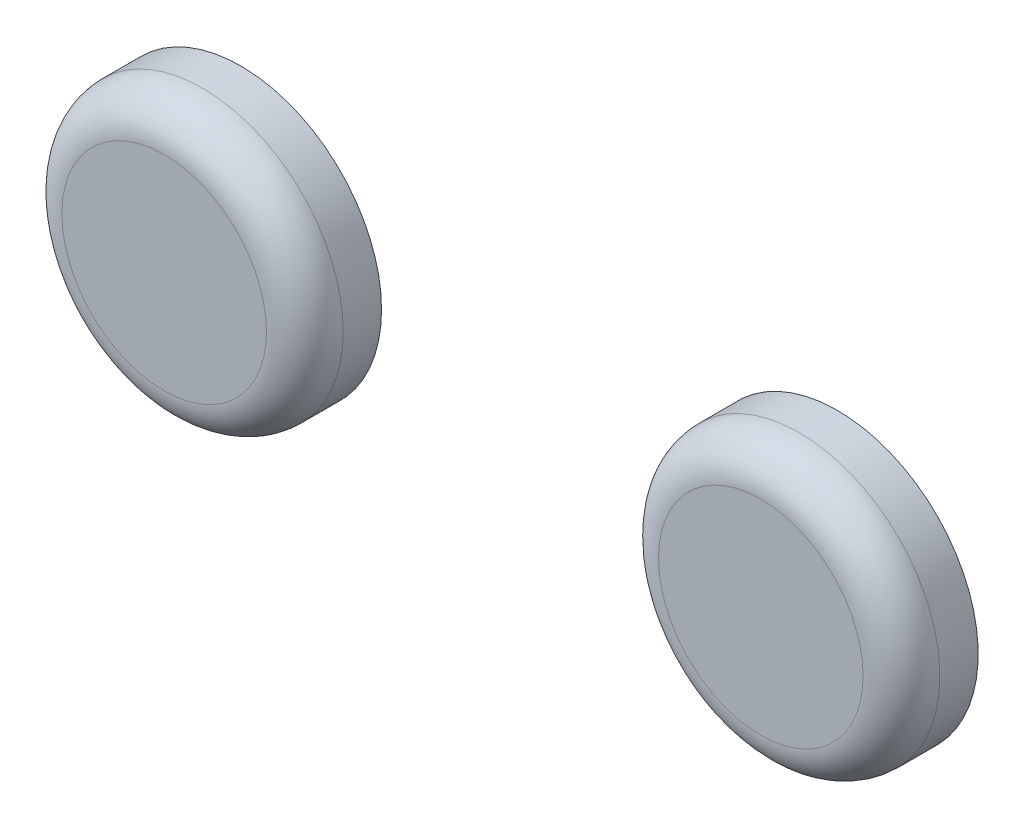
ISO-10303-21;
HEADER;
FILE_DESCRIPTION(('STEP AP214'),'2;1');
FILE_NAME('part.step','',(''),(''),'','','');
FILE_SCHEMA(('AUTOMOTIVE_DESIGN { 1 0 10303 214 1 1 1 1 }'));
ENDSEC;
DATA;
#1=APPLICATION_CONTEXT('core data for automotive mechanical design processes');
#2=APPLICATION_PROTOCOL_DEFINITION('international standard','automotive_design',2000,#1);
#3=PRODUCT_CONTEXT('',#1,'mechanical');
#4=PRODUCT('Part','Part','',(#3));
#5=PRODUCT_RELATED_PRODUCT_CATEGORY('part','',(#4));
#6=PRODUCT_DEFINITION_FORMATION('','',#4);
#7=PRODUCT_DEFINITION_CONTEXT('part definition',#1,'design');
#8=PRODUCT_DEFINITION('design','',#6,#7);
#9=PRODUCT_DEFINITION_SHAPE('','',#8);
#10=(LENGTH_UNIT() NAMED_UNIT(*) SI_UNIT(.MILLI.,.METRE.));
#11=(NAMED_UNIT(*) PLANE_ANGLE_UNIT() SI_UNIT($,.RADIAN.));
#12=(NAMED_UNIT(*) SI_UNIT($,.STERADIAN.) SOLID_ANGLE_UNIT());
#13=UNCERTAINTY_MEASURE_WITH_UNIT(LENGTH_MEASURE(1.E-05),#10,'distance_accuracy_value','');
#14=(GEOMETRIC_REPRESENTATION_CONTEXT(3) GLOBAL_UNCERTAINTY_ASSIGNED_CONTEXT((#13)) GLOBAL_UNIT_ASSIGNED_CONTEXT((#10,
#11,#12)) REPRESENTATION_CONTEXT('',''));
#15=CARTESIAN_POINT('',(0.,0.,0.));
#16=DIRECTION('',(0.,0.,1.));
#17=DIRECTION('',(1.,0.,0.));
#18=AXIS2_PLACEMENT_3D('',#15,#16,#17);
#19=CARTESIAN_POINT('',(70.,0.,18.));
#20=DIRECTION('',(0.,0.,-1.));
#21=DIRECTION('',(-1.,0.,0.));
#22=AXIS2_PLACEMENT_3D('',#19,#20,#21);
#23=CYLINDRICAL_SURFACE('',#22,33.);
#24=CARTESIAN_POINT('',(70.,0.,9.));
#25=DIRECTION('',(0.,0.,-1.));
#26=DIRECTION('',(-1.,0.,0.));
#27=AXIS2_PLACEMENT_3D('',#24,#25,#26);
#28=CIRCLE('',#27,33.);
#29=CARTESIAN_POINT('',(37.,0.,9.));
#30=VERTEX_POINT('',#29);
#31=EDGE_CURVE('E11',#30,#30,#28,.T.);
#32=ORIENTED_EDGE('',*,*,#31,.T.);
#33=EDGE_LOOP('',(#32));
#34=FACE_BOUND('',#33,.T.);
#35=CARTESIAN_POINT('',(70.,0.,0.));
#36=DIRECTION('',(0.,0.,1.));
#37=DIRECTION('',(-1.,0.,0.));
#38=AXIS2_PLACEMENT_3D('',#35,#36,#37);
#39=CIRCLE('',#38,33.);
#40=CARTESIAN_POINT('',(37.,0.,0.));
#41=VERTEX_POINT('',#40);
#42=EDGE_CURVE('E54',#41,#41,#39,.T.);
#43=ORIENTED_EDGE('',*,*,#42,.T.);
#44=EDGE_LOOP('',(#43));
#45=FACE_BOUND('',#44,.T.);
#46=ADVANCED_FACE('F43',(#34,#45),#23,.T.);
#47=CARTESIAN_POINT('',(70.,0.,18.));
#48=DIRECTION('',(0.,0.,-1.));
#49=DIRECTION('',(-1.,0.,0.));
#50=AXIS2_PLACEMENT_3D('',#47,#48,#49);
#51=PLANE('',#50);
#52=CARTESIAN_POINT('',(70.,0.,18.));
#53=DIRECTION('',(0.,0.,-1.));
#54=DIRECTION('',(-1.,0.,0.));
#55=AXIS2_PLACEMENT_3D('',#52,#53,#54);
#56=CIRCLE('',#55,24.);
#57=CARTESIAN_POINT('',(46.,0.,18.));
#58=VERTEX_POINT('',#57);
#59=EDGE_CURVE('E50',#58,#58,#56,.F.);
#60=ORIENTED_EDGE('',*,*,#59,.T.);
#61=EDGE_LOOP('',(#60));
#62=FACE_BOUND('',#61,.T.);
#63=ADVANCED_FACE('F64',(#62),#51,.F.);
#64=CARTESIAN_POINT('',(70.,0.,0.));
#65=DIRECTION('',(0.,0.,-1.));
#66=DIRECTION('',(-1.,0.,0.));
#67=AXIS2_PLACEMENT_3D('',#64,#65,#66);
#68=PLANE('',#67);
#69=ORIENTED_EDGE('',*,*,#42,.F.);
#70=EDGE_LOOP('',(#69));
#71=FACE_BOUND('',#70,.T.);
#72=ADVANCED_FACE('F62',(#71),#68,.T.);
#73=CARTESIAN_POINT('',(70.,0.,9.));
#74=DIRECTION('',(0.,0.,-1.));
#75=DIRECTION('',(-1.,0.,0.));
#76=AXIS2_PLACEMENT_3D('',#73,#74,#75);
#77=TOROIDAL_SURFACE('',#76,24.,9.);
#78=ORIENTED_EDGE('',*,*,#31,.F.);
#79=EDGE_LOOP('',(#78));
#80=FACE_BOUND('',#79,.T.);
#81=ORIENTED_EDGE('',*,*,#59,.F.);
#82=EDGE_LOOP('',(#81));
#83=FACE_BOUND('',#82,.T.);
#84=ADVANCED_FACE('F45',(#80,#83),#77,.T.);
#85=CLOSED_SHELL('',(#46,#63,#72,#84));
#86=MANIFOLD_SOLID_BREP('B2',#85);
#87=CARTESIAN_POINT('',(-70.,0.,18.));
#88=DIRECTION('',(0.,0.,-1.));
#89=DIRECTION('',(-1.,0.,0.));
#90=AXIS2_PLACEMENT_3D('',#87,#88,#89);
#91=CYLINDRICAL_SURFACE('',#90,33.);
#92=CARTESIAN_POINT('',(-70.,0.,9.));
#93=DIRECTION('',(0.,0.,1.));
#94=DIRECTION('',(1.,0.,0.));
#95=AXIS2_PLACEMENT_3D('',#92,#93,#94);
#96=CIRCLE('',#95,33.);
#97=CARTESIAN_POINT('',(-37.,0.,9.));
#98=VERTEX_POINT('',#97);
#99=EDGE_CURVE('E42',#98,#98,#96,.F.);
#100=ORIENTED_EDGE('',*,*,#99,.T.);
#101=EDGE_LOOP('',(#100));
#102=FACE_BOUND('',#101,.T.);
#103=CARTESIAN_POINT('',(-70.,0.,0.));
#104=DIRECTION('',(0.,0.,1.));
#105=DIRECTION('',(1.,0.,0.));
#106=AXIS2_PLACEMENT_3D('',#103,#104,#105);
#107=CIRCLE('',#106,33.);
#108=CARTESIAN_POINT('',(-37.,0.,0.));
#109=VERTEX_POINT('',#108);
#110=EDGE_CURVE('E110',#109,#109,#107,.T.);
#111=ORIENTED_EDGE('',*,*,#110,.T.);
#112=EDGE_LOOP('',(#111));
#113=FACE_BOUND('',#112,.T.);
#114=ADVANCED_FACE('F99',(#102,#113),#91,.T.);
#115=CARTESIAN_POINT('',(-70.,0.,18.));
#116=DIRECTION('',(0.,0.,1.));
#117=DIRECTION('',(1.,0.,0.));
#118=AXIS2_PLACEMENT_3D('',#115,#116,#117);
#119=PLANE('',#118);
#120=CARTESIAN_POINT('',(-70.,0.,18.));
#121=DIRECTION('',(0.,0.,1.));
#122=DIRECTION('',(1.,0.,0.));
#123=AXIS2_PLACEMENT_3D('',#120,#121,#122);
#124=CIRCLE('',#123,24.);
#125=CARTESIAN_POINT('',(-46.,0.,18.));
#126=VERTEX_POINT('',#125);
#127=EDGE_CURVE('E106',#126,#126,#124,.T.);
#128=ORIENTED_EDGE('',*,*,#127,.T.);
#129=EDGE_LOOP('',(#128));
#130=FACE_BOUND('',#129,.T.);
#131=ADVANCED_FACE('F120',(#130),#119,.T.);
#132=CARTESIAN_POINT('',(-70.,0.,0.));
#133=DIRECTION('',(0.,0.,1.));
#134=DIRECTION('',(1.,0.,0.));
#135=AXIS2_PLACEMENT_3D('',#132,#133,#134);
#136=PLANE('',#135);
#137=ORIENTED_EDGE('',*,*,#110,.F.);
#138=EDGE_LOOP('',(#137));
#139=FACE_BOUND('',#138,.T.);
#140=ADVANCED_FACE('F118',(#139),#136,.F.);
#141=CARTESIAN_POINT('',(-70.,0.,9.));
#142=DIRECTION('',(0.,0.,1.));
#143=DIRECTION('',(1.,0.,0.));
#144=AXIS2_PLACEMENT_3D('',#141,#142,#143);
#145=TOROIDAL_SURFACE('',#144,24.,9.);
#146=ORIENTED_EDGE('',*,*,#99,.F.);
#147=EDGE_LOOP('',(#146));
#148=FACE_BOUND('',#147,.T.);
#149=ORIENTED_EDGE('',*,*,#127,.F.);
#150=EDGE_LOOP('',(#149));
#151=FACE_BOUND('',#150,.T.);
#152=ADVANCED_FACE('F101',(#148,#151),#145,.T.);
#153=CLOSED_SHELL('',(#114,#131,#140,#152));
#154=MANIFOLD_SOLID_BREP('B6',#153);
#155=ADVANCED_BREP_SHAPE_REPRESENTATION('',(#18,#86,#154),#14);
#156=SHAPE_DEFINITION_REPRESENTATION(#9,#155);
ENDSEC;
END-ISO-10303-21;
